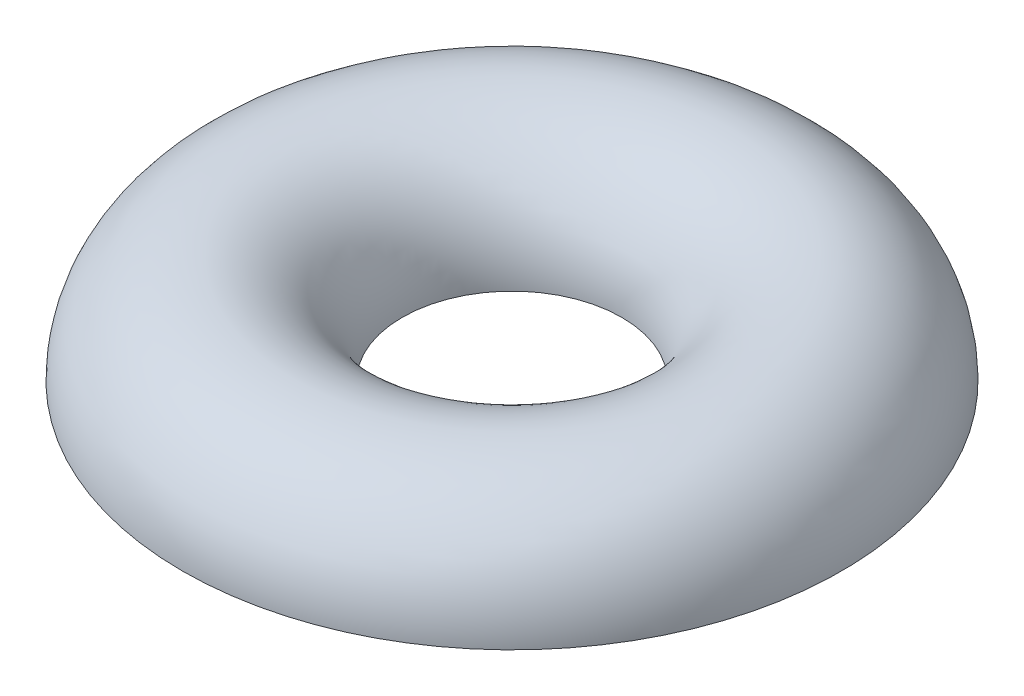
ISO-10303-21;
HEADER;
FILE_DESCRIPTION(('STEP AP214'),'2;1');
FILE_NAME('part.step','',(''),(''),'','','');
FILE_SCHEMA(('AUTOMOTIVE_DESIGN { 1 0 10303 214 1 1 1 1 }'));
ENDSEC;
DATA;
#1=APPLICATION_CONTEXT('core data for automotive mechanical design processes');
#2=APPLICATION_PROTOCOL_DEFINITION('international standard','automotive_design',2000,#1);
#3=PRODUCT_CONTEXT('',#1,'mechanical');
#4=PRODUCT('Part','Part','',(#3));
#5=PRODUCT_RELATED_PRODUCT_CATEGORY('part','',(#4));
#6=PRODUCT_DEFINITION_FORMATION('','',#4);
#7=PRODUCT_DEFINITION_CONTEXT('part definition',#1,'design');
#8=PRODUCT_DEFINITION('design','',#6,#7);
#9=PRODUCT_DEFINITION_SHAPE('','',#8);
#10=(LENGTH_UNIT() NAMED_UNIT(*) SI_UNIT(.MILLI.,.METRE.));
#11=(NAMED_UNIT(*) PLANE_ANGLE_UNIT() SI_UNIT($,.RADIAN.));
#12=(NAMED_UNIT(*) SI_UNIT($,.STERADIAN.) SOLID_ANGLE_UNIT());
#13=UNCERTAINTY_MEASURE_WITH_UNIT(LENGTH_MEASURE(1.E-05),#10,'distance_accuracy_value','');
#14=(GEOMETRIC_REPRESENTATION_CONTEXT(3) GLOBAL_UNCERTAINTY_ASSIGNED_CONTEXT((#13)) GLOBAL_UNIT_ASSIGNED_CONTEXT((#10,
#11,#12)) REPRESENTATION_CONTEXT('',''));
#15=CARTESIAN_POINT('',(0.,0.,0.));
#16=DIRECTION('',(0.,0.,1.));
#17=DIRECTION('',(1.,0.,0.));
#18=AXIS2_PLACEMENT_3D('',#15,#16,#17);
#19=CARTESIAN_POINT('',(0.,0.,0.));
#20=DIRECTION('',(0.,1.,0.));
#21=DIRECTION('',(0.,0.,1.));
#22=AXIS2_PLACEMENT_3D('',#19,#20,#21);
#23=TOROIDAL_SURFACE('',#22,50.8,25.4);
#24=CARTESIAN_POINT('',(0.,0.,0.));
#25=DIRECTION('',(0.,1.,0.));
#26=DIRECTION('',(0.,0.,1.));
#27=AXIS2_PLACEMENT_3D('',#24,#25,#26);
#28=CIRCLE('',#27,76.2);
#29=CARTESIAN_POINT('',(0.,0.,76.2));
#30=VERTEX_POINT('',#29);
#31=EDGE_CURVE('E10',#30,#30,#28,.T.);
#32=ORIENTED_EDGE('',*,*,#31,.T.);
#33=EDGE_LOOP('',(#32));
#34=FACE_BOUND('',#33,.T.);
#35=CARTESIAN_POINT('',(0.,0.,0.));
#36=DIRECTION('',(0.,-1.,0.));
#37=DIRECTION('',(0.,0.,-1.));
#38=AXIS2_PLACEMENT_3D('',#35,#36,#37);
#39=CIRCLE('',#38,25.4);
#40=CARTESIAN_POINT('',(0.,0.,-25.4));
#41=VERTEX_POINT('',#40);
#42=EDGE_CURVE('E45',#41,#41,#39,.T.);
#43=ORIENTED_EDGE('',*,*,#42,.T.);
#44=EDGE_LOOP('',(#43));
#45=FACE_BOUND('',#44,.T.);
#46=ADVANCED_FACE('F39',(#34,#45),#23,.T.);
#47=CARTESIAN_POINT('',(79.2552366502297,0.,-76.2));
#48=DIRECTION('',(0.,1.,0.));
#49=DIRECTION('',(0.,0.,1.));
#50=AXIS2_PLACEMENT_3D('',#47,#48,#49);
#51=PLANE('',#50);
#52=ORIENTED_EDGE('',*,*,#42,.F.);
#53=EDGE_LOOP('',(#52));
#54=FACE_BOUND('',#53,.T.);
#55=ORIENTED_EDGE('',*,*,#31,.F.);
#56=EDGE_LOOP('',(#55));
#57=FACE_BOUND('',#56,.T.);
#58=ADVANCED_FACE('F52',(#54,#57),#51,.F.);
#59=CLOSED_SHELL('',(#46,#58));
#60=MANIFOLD_SOLID_BREP('B2',#59);
#61=ADVANCED_BREP_SHAPE_REPRESENTATION('',(#18,#60),#14);
#62=SHAPE_DEFINITION_REPRESENTATION(#9,#61);
ENDSEC;
END-ISO-10303-21;
